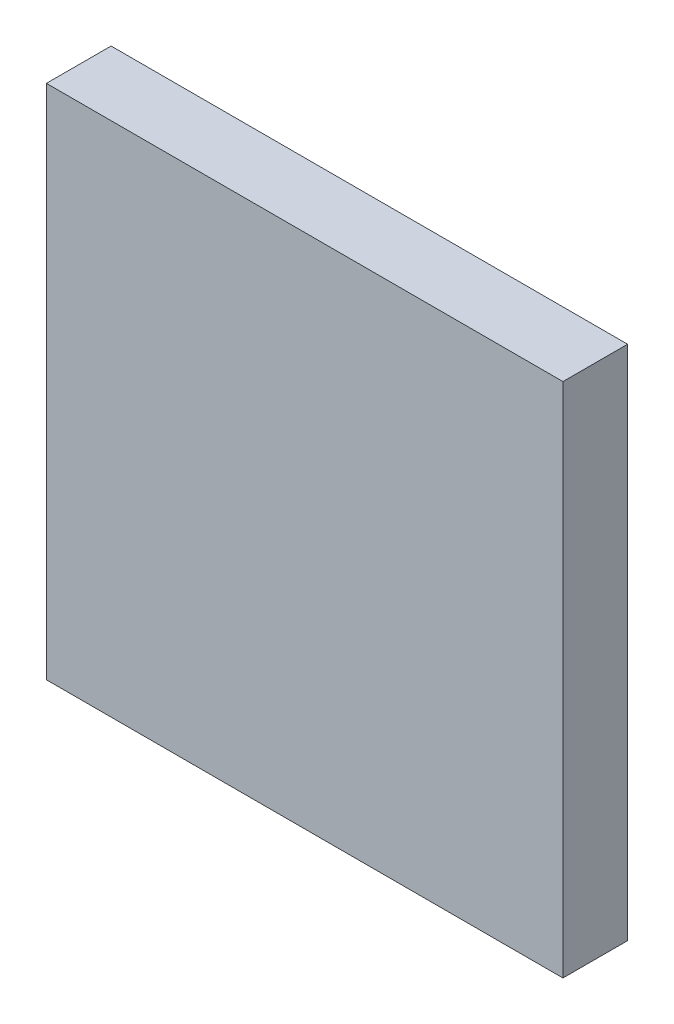
ISO-10303-21;
HEADER;
FILE_DESCRIPTION(('STEP AP214'),'2;1');
FILE_NAME('part.step','',(''),(''),'','','');
FILE_SCHEMA(('AUTOMOTIVE_DESIGN { 1 0 10303 214 1 1 1 1 }'));
ENDSEC;
DATA;
#1=APPLICATION_CONTEXT('core data for automotive mechanical design processes');
#2=APPLICATION_PROTOCOL_DEFINITION('international standard','automotive_design',2000,#1);
#3=PRODUCT_CONTEXT('',#1,'mechanical');
#4=PRODUCT('Part','Part','',(#3));
#5=PRODUCT_RELATED_PRODUCT_CATEGORY('part','',(#4));
#6=PRODUCT_DEFINITION_FORMATION('','',#4);
#7=PRODUCT_DEFINITION_CONTEXT('part definition',#1,'design');
#8=PRODUCT_DEFINITION('design','',#6,#7);
#9=PRODUCT_DEFINITION_SHAPE('','',#8);
#10=(LENGTH_UNIT() NAMED_UNIT(*) SI_UNIT(.MILLI.,.METRE.));
#11=(NAMED_UNIT(*) PLANE_ANGLE_UNIT() SI_UNIT($,.RADIAN.));
#12=(NAMED_UNIT(*) SI_UNIT($,.STERADIAN.) SOLID_ANGLE_UNIT());
#13=UNCERTAINTY_MEASURE_WITH_UNIT(LENGTH_MEASURE(1.E-05),#10,'distance_accuracy_value','');
#14=(GEOMETRIC_REPRESENTATION_CONTEXT(3) GLOBAL_UNCERTAINTY_ASSIGNED_CONTEXT((#13)) GLOBAL_UNIT_ASSIGNED_CONTEXT((#10,
#11,#12)) REPRESENTATION_CONTEXT('',''));
#15=CARTESIAN_POINT('',(0.,0.,0.));
#16=DIRECTION('',(0.,0.,1.));
#17=DIRECTION('',(1.,0.,0.));
#18=AXIS2_PLACEMENT_3D('',#15,#16,#17);
#19=CARTESIAN_POINT('',(12.7,-12.7,3.18));
#20=DIRECTION('',(-1.,0.,0.));
#21=DIRECTION('',(0.,0.,1.));
#22=AXIS2_PLACEMENT_3D('',#19,#20,#21);
#23=PLANE('',#22);
#24=DIRECTION('',(0.,1.,0.));
#25=VECTOR('',#24,1.);
#26=CARTESIAN_POINT('',(12.7,-12.7,0.));
#27=LINE('',#26,#25);
#28=CARTESIAN_POINT('',(12.7,-12.7,0.));
#29=VERTEX_POINT('',#28);
#30=CARTESIAN_POINT('',(12.7,12.7,0.));
#31=VERTEX_POINT('',#30);
#32=EDGE_CURVE('E97',#29,#31,#27,.T.);
#33=ORIENTED_EDGE('',*,*,#32,.T.);
#34=DIRECTION('',(0.,0.,-1.));
#35=VECTOR('',#34,1.);
#36=CARTESIAN_POINT('',(12.7,12.7,3.18));
#37=LINE('',#36,#35);
#38=CARTESIAN_POINT('',(12.7,12.7,3.18));
#39=VERTEX_POINT('',#38);
#40=EDGE_CURVE('E11',#39,#31,#37,.T.);
#41=ORIENTED_EDGE('',*,*,#40,.F.);
#42=DIRECTION('',(0.,1.,0.));
#43=VECTOR('',#42,1.);
#44=CARTESIAN_POINT('',(12.7,-12.7,3.18));
#45=LINE('',#44,#43);
#46=CARTESIAN_POINT('',(12.7,-12.7,3.18));
#47=VERTEX_POINT('',#46);
#48=EDGE_CURVE('E85',#47,#39,#45,.T.);
#49=ORIENTED_EDGE('',*,*,#48,.F.);
#50=DIRECTION('',(0.,0.,-1.));
#51=VECTOR('',#50,1.);
#52=CARTESIAN_POINT('',(12.7,-12.7,3.18));
#53=LINE('',#52,#51);
#54=EDGE_CURVE('E93',#47,#29,#53,.T.);
#55=ORIENTED_EDGE('',*,*,#54,.T.);
#56=EDGE_LOOP('',(#33,#41,#49,#55));
#57=FACE_BOUND('',#56,.T.);
#58=ADVANCED_FACE('F34',(#57),#23,.F.);
#59=CARTESIAN_POINT('',(-12.7,12.7,3.18));
#60=DIRECTION('',(0.,-1.,0.));
#61=DIRECTION('',(0.,0.,-1.));
#62=AXIS2_PLACEMENT_3D('',#59,#60,#61);
#63=PLANE('',#62);
#64=DIRECTION('',(-1.,0.,0.));
#65=VECTOR('',#64,1.);
#66=CARTESIAN_POINT('',(-12.7,12.7,0.));
#67=LINE('',#66,#65);
#68=CARTESIAN_POINT('',(-12.7,12.7,0.));
#69=VERTEX_POINT('',#68);
#70=EDGE_CURVE('E89',#31,#69,#67,.T.);
#71=ORIENTED_EDGE('',*,*,#70,.T.);
#72=DIRECTION('',(0.,0.,-1.));
#73=VECTOR('',#72,1.);
#74=CARTESIAN_POINT('',(-12.7,12.7,3.18));
#75=LINE('',#74,#73);
#76=CARTESIAN_POINT('',(-12.7,12.7,3.18));
#77=VERTEX_POINT('',#76);
#78=EDGE_CURVE('E42',#77,#69,#75,.T.);
#79=ORIENTED_EDGE('',*,*,#78,.F.);
#80=DIRECTION('',(-1.,0.,0.));
#81=VECTOR('',#80,1.);
#82=CARTESIAN_POINT('',(-12.7,12.7,3.18));
#83=LINE('',#82,#81);
#84=EDGE_CURVE('E80',#39,#77,#83,.T.);
#85=ORIENTED_EDGE('',*,*,#84,.F.);
#86=ORIENTED_EDGE('',*,*,#40,.T.);
#87=EDGE_LOOP('',(#71,#79,#85,#86));
#88=FACE_BOUND('',#87,.T.);
#89=ADVANCED_FACE('F88',(#88),#63,.F.);
#90=CARTESIAN_POINT('',(-12.7,-12.7,3.18));
#91=DIRECTION('',(1.,0.,0.));
#92=DIRECTION('',(0.,0.,-1.));
#93=AXIS2_PLACEMENT_3D('',#90,#91,#92);
#94=PLANE('',#93);
#95=DIRECTION('',(0.,-1.,0.));
#96=VECTOR('',#95,1.);
#97=CARTESIAN_POINT('',(-12.7,-12.7,0.));
#98=LINE('',#97,#96);
#99=CARTESIAN_POINT('',(-12.7,-12.7,0.));
#100=VERTEX_POINT('',#99);
#101=EDGE_CURVE('E67',#69,#100,#98,.T.);
#102=ORIENTED_EDGE('',*,*,#101,.T.);
#103=DIRECTION('',(0.,0.,-1.));
#104=VECTOR('',#103,1.);
#105=CARTESIAN_POINT('',(-12.7,-12.7,3.18));
#106=LINE('',#105,#104);
#107=CARTESIAN_POINT('',(-12.7,-12.7,3.18));
#108=VERTEX_POINT('',#107);
#109=EDGE_CURVE('E90',#108,#100,#106,.T.);
#110=ORIENTED_EDGE('',*,*,#109,.F.);
#111=DIRECTION('',(0.,-1.,0.));
#112=VECTOR('',#111,1.);
#113=CARTESIAN_POINT('',(-12.7,-12.7,3.18));
#114=LINE('',#113,#112);
#115=EDGE_CURVE('E83',#77,#108,#114,.T.);
#116=ORIENTED_EDGE('',*,*,#115,.F.);
#117=ORIENTED_EDGE('',*,*,#78,.T.);
#118=EDGE_LOOP('',(#102,#110,#116,#117));
#119=FACE_BOUND('',#118,.T.);
#120=ADVANCED_FACE('F91',(#119),#94,.F.);
#121=CARTESIAN_POINT('',(-12.7,-12.7,3.18));
#122=DIRECTION('',(0.,1.,0.));
#123=DIRECTION('',(0.,0.,1.));
#124=AXIS2_PLACEMENT_3D('',#121,#122,#123);
#125=PLANE('',#124);
#126=DIRECTION('',(1.,0.,0.));
#127=VECTOR('',#126,1.);
#128=CARTESIAN_POINT('',(-12.7,-12.7,0.));
#129=LINE('',#128,#127);
#130=EDGE_CURVE('E73',#100,#29,#129,.T.);
#131=ORIENTED_EDGE('',*,*,#130,.T.);
#132=ORIENTED_EDGE('',*,*,#54,.F.);
#133=DIRECTION('',(1.,0.,0.));
#134=VECTOR('',#133,1.);
#135=CARTESIAN_POINT('',(-12.7,-12.7,3.18));
#136=LINE('',#135,#134);
#137=EDGE_CURVE('E50',#108,#47,#136,.T.);
#138=ORIENTED_EDGE('',*,*,#137,.F.);
#139=ORIENTED_EDGE('',*,*,#109,.T.);
#140=EDGE_LOOP('',(#131,#132,#138,#139));
#141=FACE_BOUND('',#140,.T.);
#142=ADVANCED_FACE('F104',(#141),#125,.F.);
#143=CARTESIAN_POINT('',(0.,0.,3.18));
#144=DIRECTION('',(0.,0.,-1.));
#145=DIRECTION('',(-1.,0.,0.));
#146=AXIS2_PLACEMENT_3D('',#143,#144,#145);
#147=PLANE('',#146);
#148=ORIENTED_EDGE('',*,*,#48,.T.);
#149=ORIENTED_EDGE('',*,*,#84,.T.);
#150=ORIENTED_EDGE('',*,*,#115,.T.);
#151=ORIENTED_EDGE('',*,*,#137,.T.);
#152=EDGE_LOOP('',(#148,#149,#150,#151));
#153=FACE_BOUND('',#152,.T.);
#154=ADVANCED_FACE('F81',(#153),#147,.F.);
#155=CARTESIAN_POINT('',(0.,0.,0.));
#156=DIRECTION('',(0.,0.,-1.));
#157=DIRECTION('',(-1.,0.,0.));
#158=AXIS2_PLACEMENT_3D('',#155,#156,#157);
#159=PLANE('',#158);
#160=ORIENTED_EDGE('',*,*,#32,.F.);
#161=ORIENTED_EDGE('',*,*,#130,.F.);
#162=ORIENTED_EDGE('',*,*,#101,.F.);
#163=ORIENTED_EDGE('',*,*,#70,.F.);
#164=EDGE_LOOP('',(#160,#161,#162,#163));
#165=FACE_BOUND('',#164,.T.);
#166=ADVANCED_FACE('F107',(#165),#159,.T.);
#167=CLOSED_SHELL('',(#58,#89,#120,#142,#154,#166));
#168=MANIFOLD_SOLID_BREP('B2',#167);
#169=ADVANCED_BREP_SHAPE_REPRESENTATION('',(#18,#168),#14);
#170=SHAPE_DEFINITION_REPRESENTATION(#9,#169);
ENDSEC;
END-ISO-10303-21;
